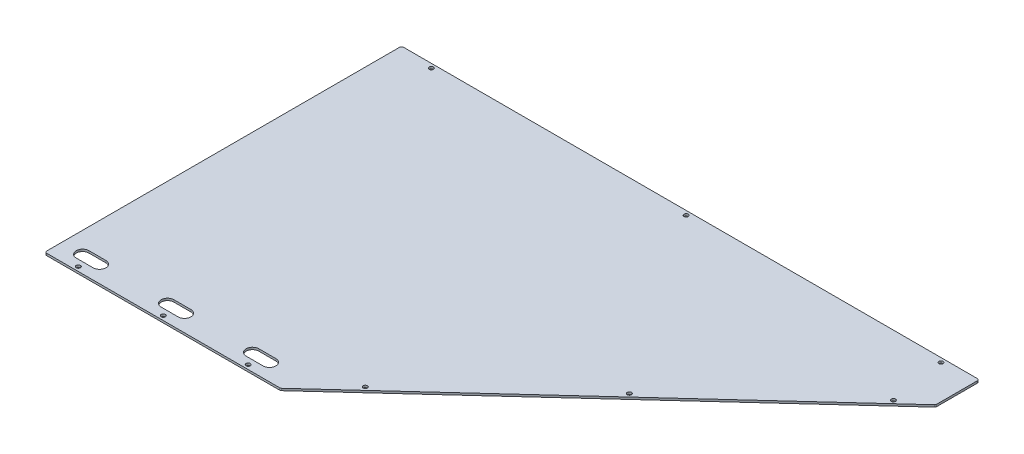
ISO-10303-21;
HEADER;
FILE_DESCRIPTION(('STEP AP214'),'2;1');
FILE_NAME('part.step','',(''),(''),'','','');
FILE_SCHEMA(('AUTOMOTIVE_DESIGN { 1 0 10303 214 1 1 1 1 }'));
ENDSEC;
DATA;
#1=APPLICATION_CONTEXT('core data for automotive mechanical design processes');
#2=APPLICATION_PROTOCOL_DEFINITION('international standard','automotive_design',2000,#1);
#3=PRODUCT_CONTEXT('',#1,'mechanical');
#4=PRODUCT('Part','Part','',(#3));
#5=PRODUCT_RELATED_PRODUCT_CATEGORY('part','',(#4));
#6=PRODUCT_DEFINITION_FORMATION('','',#4);
#7=PRODUCT_DEFINITION_CONTEXT('part definition',#1,'design');
#8=PRODUCT_DEFINITION('design','',#6,#7);
#9=PRODUCT_DEFINITION_SHAPE('','',#8);
#10=(LENGTH_UNIT() NAMED_UNIT(*) SI_UNIT(.MILLI.,.METRE.));
#11=(NAMED_UNIT(*) PLANE_ANGLE_UNIT() SI_UNIT($,.RADIAN.));
#12=(NAMED_UNIT(*) SI_UNIT($,.STERADIAN.) SOLID_ANGLE_UNIT());
#13=UNCERTAINTY_MEASURE_WITH_UNIT(LENGTH_MEASURE(1.E-05),#10,'distance_accuracy_value','');
#14=(GEOMETRIC_REPRESENTATION_CONTEXT(3) GLOBAL_UNCERTAINTY_ASSIGNED_CONTEXT((#13)) GLOBAL_UNIT_ASSIGNED_CONTEXT((#10,
#11,#12)) REPRESENTATION_CONTEXT('',''));
#15=CARTESIAN_POINT('',(0.,0.,0.));
#16=DIRECTION('',(0.,0.,1.));
#17=DIRECTION('',(1.,0.,0.));
#18=AXIS2_PLACEMENT_3D('',#15,#16,#17);
#19=CARTESIAN_POINT('',(0.,3.175,-533.4));
#20=DIRECTION('',(1.,0.,0.));
#21=DIRECTION('',(0.,0.,-1.));
#22=AXIS2_PLACEMENT_3D('',#19,#20,#21);
#23=PLANE('',#22);
#24=DIRECTION('',(0.,0.,1.));
#25=VECTOR('',#24,1.);
#26=CARTESIAN_POINT('',(0.,3.175,-533.4));
#27=LINE('',#26,#25);
#28=CARTESIAN_POINT('',(0.,3.175,-530.225));
#29=VERTEX_POINT('',#28);
#30=CARTESIAN_POINT('',(0.,3.175,-3.17500000000004));
#31=VERTEX_POINT('',#30);
#32=EDGE_CURVE('E340',#29,#31,#27,.T.);
#33=ORIENTED_EDGE('',*,*,#32,.F.);
#34=DIRECTION('',(0.,-1.,0.));
#35=VECTOR('',#34,1.);
#36=CARTESIAN_POINT('',(0.,3.175,-530.225));
#37=LINE('',#36,#35);
#38=CARTESIAN_POINT('',(0.,0.,-530.225));
#39=VERTEX_POINT('',#38);
#40=EDGE_CURVE('E371',#29,#39,#37,.T.);
#41=ORIENTED_EDGE('',*,*,#40,.T.);
#42=DIRECTION('',(0.,0.,1.));
#43=VECTOR('',#42,1.);
#44=CARTESIAN_POINT('',(0.,0.,-533.4));
#45=LINE('',#44,#43);
#46=CARTESIAN_POINT('',(0.,0.,-3.17500000000004));
#47=VERTEX_POINT('',#46);
#48=EDGE_CURVE('E339',#39,#47,#45,.T.);
#49=ORIENTED_EDGE('',*,*,#48,.T.);
#50=DIRECTION('',(0.,-1.,0.));
#51=VECTOR('',#50,1.);
#52=CARTESIAN_POINT('',(0.,3.175,-3.17500000000004));
#53=LINE('',#52,#51);
#54=EDGE_CURVE('E356',#47,#31,#53,.F.);
#55=ORIENTED_EDGE('',*,*,#54,.T.);
#56=EDGE_LOOP('',(#33,#41,#49,#55));
#57=FACE_BOUND('',#56,.T.);
#58=ADVANCED_FACE('F34',(#57),#23,.F.);
#59=CARTESIAN_POINT('',(0.,3.175,0.));
#60=DIRECTION('',(0.,0.,-1.));
#61=DIRECTION('',(-1.,0.,0.));
#62=AXIS2_PLACEMENT_3D('',#59,#60,#61);
#63=PLANE('',#62);
#64=DIRECTION('',(1.,0.,0.));
#65=VECTOR('',#64,1.);
#66=CARTESIAN_POINT('',(0.,0.,0.));
#67=LINE('',#66,#65);
#68=CARTESIAN_POINT('',(3.175,0.,0.));
#69=VERTEX_POINT('',#68);
#70=CARTESIAN_POINT('',(351.190310026367,0.,0.));
#71=VERTEX_POINT('',#70);
#72=EDGE_CURVE('E359',#69,#71,#67,.T.);
#73=ORIENTED_EDGE('',*,*,#72,.T.);
#74=DIRECTION('',(0.,-1.,0.));
#75=VECTOR('',#74,1.);
#76=CARTESIAN_POINT('',(351.190310026367,3.175,0.));
#77=LINE('',#76,#75);
#78=CARTESIAN_POINT('',(351.190310026367,3.175,0.));
#79=VERTEX_POINT('',#78);
#80=EDGE_CURVE('E407',#71,#79,#77,.F.);
#81=ORIENTED_EDGE('',*,*,#80,.T.);
#82=DIRECTION('',(1.,0.,0.));
#83=VECTOR('',#82,1.);
#84=CARTESIAN_POINT('',(0.,3.175,0.));
#85=LINE('',#84,#83);
#86=CARTESIAN_POINT('',(3.175,3.175,0.));
#87=VERTEX_POINT('',#86);
#88=EDGE_CURVE('E343',#87,#79,#85,.T.);
#89=ORIENTED_EDGE('',*,*,#88,.F.);
#90=DIRECTION('',(0.,-1.,0.));
#91=VECTOR('',#90,1.);
#92=CARTESIAN_POINT('',(3.175,3.175,0.));
#93=LINE('',#92,#91);
#94=EDGE_CURVE('E404',#87,#69,#93,.T.);
#95=ORIENTED_EDGE('',*,*,#94,.T.);
#96=EDGE_LOOP('',(#73,#81,#89,#95));
#97=FACE_BOUND('',#96,.T.);
#98=ADVANCED_FACE('F445',(#97),#63,.F.);
#99=CARTESIAN_POINT('',(352.425,3.175,0.));
#100=DIRECTION('',(-0.675590207615662,0.,-0.737277336810123));
#101=DIRECTION('',(-0.737277336810123,0.,0.675590207615662));
#102=AXIS2_PLACEMENT_3D('',#99,#100,#101);
#103=PLANE('',#102);
#104=DIRECTION('',(0.737277336810123,0.,-0.675590207615662));
#105=VECTOR('',#104,1.);
#106=CARTESIAN_POINT('',(352.425,3.175,0.));
#107=LINE('',#106,#105);
#108=CARTESIAN_POINT('',(353.335308935546,3.175,-0.834144455627875));
#109=VERTEX_POINT('',#108);
#110=CARTESIAN_POINT('',(862.56999890918,3.175,-467.461765769568));
#111=VERTEX_POINT('',#110);
#112=EDGE_CURVE('E347',#109,#111,#107,.T.);
#113=ORIENTED_EDGE('',*,*,#112,.F.);
#114=DIRECTION('',(0.,-1.,0.));
#115=VECTOR('',#114,1.);
#116=CARTESIAN_POINT('',(353.335308935546,3.175,-0.834144455627872));
#117=LINE('',#116,#115);
#118=CARTESIAN_POINT('',(353.335308935546,0.,-0.834144455627875));
#119=VERTEX_POINT('',#118);
#120=EDGE_CURVE('E401',#109,#119,#117,.T.);
#121=ORIENTED_EDGE('',*,*,#120,.T.);
#122=DIRECTION('',(0.737277336810123,0.,-0.675590207615662));
#123=VECTOR('',#122,1.);
#124=CARTESIAN_POINT('',(352.425,0.,0.));
#125=LINE('',#124,#123);
#126=CARTESIAN_POINT('',(862.56999890918,0.,-467.461765769568));
#127=VERTEX_POINT('',#126);
#128=EDGE_CURVE('E362',#119,#127,#125,.T.);
#129=ORIENTED_EDGE('',*,*,#128,.T.);
#130=DIRECTION('',(0.,-1.,0.));
#131=VECTOR('',#130,1.);
#132=CARTESIAN_POINT('',(862.56999890918,3.175,-467.461765769568));
#133=LINE('',#132,#131);
#134=EDGE_CURVE('E399',#127,#111,#133,.F.);
#135=ORIENTED_EDGE('',*,*,#134,.T.);
#136=EDGE_LOOP('',(#113,#121,#129,#135));
#137=FACE_BOUND('',#136,.T.);
#138=ADVANCED_FACE('F453',(#137),#103,.F.);
#139=CARTESIAN_POINT('',(863.6,3.175,-533.4));
#140=DIRECTION('',(-1.,0.,0.));
#141=DIRECTION('',(0.,0.,1.));
#142=AXIS2_PLACEMENT_3D('',#139,#140,#141);
#143=PLANE('',#142);
#144=DIRECTION('',(0.,0.,-1.));
#145=VECTOR('',#144,1.);
#146=CARTESIAN_POINT('',(863.6,0.,-533.4));
#147=LINE('',#146,#145);
#148=CARTESIAN_POINT('',(863.6,0.,-469.80262131394));
#149=VERTEX_POINT('',#148);
#150=CARTESIAN_POINT('',(863.6,0.,-530.225));
#151=VERTEX_POINT('',#150);
#152=EDGE_CURVE('E365',#149,#151,#147,.T.);
#153=ORIENTED_EDGE('',*,*,#152,.T.);
#154=DIRECTION('',(0.,-1.,0.));
#155=VECTOR('',#154,1.);
#156=CARTESIAN_POINT('',(863.6,3.175,-530.225));
#157=LINE('',#156,#155);
#158=CARTESIAN_POINT('',(863.6,3.175,-530.225));
#159=VERTEX_POINT('',#158);
#160=EDGE_CURVE('E11',#151,#159,#157,.F.);
#161=ORIENTED_EDGE('',*,*,#160,.T.);
#162=DIRECTION('',(0.,0.,-1.));
#163=VECTOR('',#162,1.);
#164=CARTESIAN_POINT('',(863.6,3.175,-533.4));
#165=LINE('',#164,#163);
#166=CARTESIAN_POINT('',(863.6,3.175,-469.80262131394));
#167=VERTEX_POINT('',#166);
#168=EDGE_CURVE('E350',#167,#159,#165,.T.);
#169=ORIENTED_EDGE('',*,*,#168,.F.);
#170=DIRECTION('',(0.,-1.,0.));
#171=VECTOR('',#170,1.);
#172=CARTESIAN_POINT('',(863.6,3.175,-469.80262131394));
#173=LINE('',#172,#171);
#174=EDGE_CURVE('E42',#167,#149,#173,.T.);
#175=ORIENTED_EDGE('',*,*,#174,.T.);
#176=EDGE_LOOP('',(#153,#161,#169,#175));
#177=FACE_BOUND('',#176,.T.);
#178=ADVANCED_FACE('F413',(#177),#143,.F.);
#179=CARTESIAN_POINT('',(863.6,3.175,-533.4));
#180=DIRECTION('',(0.,0.,1.));
#181=DIRECTION('',(1.,0.,0.));
#182=AXIS2_PLACEMENT_3D('',#179,#180,#181);
#183=PLANE('',#182);
#184=DIRECTION('',(-1.,0.,0.));
#185=VECTOR('',#184,1.);
#186=CARTESIAN_POINT('',(863.6,0.,-533.4));
#187=LINE('',#186,#185);
#188=CARTESIAN_POINT('',(860.425,0.,-533.4));
#189=VERTEX_POINT('',#188);
#190=CARTESIAN_POINT('',(3.17500000000004,0.,-533.4));
#191=VERTEX_POINT('',#190);
#192=EDGE_CURVE('E344',#189,#191,#187,.T.);
#193=ORIENTED_EDGE('',*,*,#192,.T.);
#194=DIRECTION('',(0.,-1.,0.));
#195=VECTOR('',#194,1.);
#196=CARTESIAN_POINT('',(3.17500000000004,3.175,-533.4));
#197=LINE('',#196,#195);
#198=CARTESIAN_POINT('',(3.17500000000004,3.175,-533.4));
#199=VERTEX_POINT('',#198);
#200=EDGE_CURVE('E387',#191,#199,#197,.F.);
#201=ORIENTED_EDGE('',*,*,#200,.T.);
#202=DIRECTION('',(-1.,0.,0.));
#203=VECTOR('',#202,1.);
#204=CARTESIAN_POINT('',(863.6,3.175,-533.4));
#205=LINE('',#204,#203);
#206=CARTESIAN_POINT('',(860.425,3.175,-533.4));
#207=VERTEX_POINT('',#206);
#208=EDGE_CURVE('E353',#207,#199,#205,.T.);
#209=ORIENTED_EDGE('',*,*,#208,.F.);
#210=DIRECTION('',(0.,-1.,0.));
#211=VECTOR('',#210,1.);
#212=CARTESIAN_POINT('',(860.425,3.175,-533.4));
#213=LINE('',#212,#211);
#214=EDGE_CURVE('E384',#207,#189,#213,.T.);
#215=ORIENTED_EDGE('',*,*,#214,.T.);
#216=EDGE_LOOP('',(#193,#201,#209,#215));
#217=FACE_BOUND('',#216,.T.);
#218=ADVANCED_FACE('F427',(#217),#183,.F.);
#219=CARTESIAN_POINT('',(0.,3.175,0.));
#220=DIRECTION('',(0.,1.,0.));
#221=DIRECTION('',(0.,0.,1.));
#222=AXIS2_PLACEMENT_3D('',#219,#220,#221);
#223=PLANE('',#222);
#224=CARTESIAN_POINT('',(285.132655013183,3.175,-25.4));
#225=DIRECTION('',(0.,1.,0.));
#226=DIRECTION('',(0.,0.,1.));
#227=AXIS2_PLACEMENT_3D('',#224,#225,#226);
#228=CIRCLE('',#227,9.525);
#229=CARTESIAN_POINT('',(285.132655013183,3.175,-34.925));
#230=VERTEX_POINT('',#229);
#231=CARTESIAN_POINT('',(285.132655013183,3.175,-15.875));
#232=VERTEX_POINT('',#231);
#233=EDGE_CURVE('E49',#230,#232,#228,.T.);
#234=ORIENTED_EDGE('',*,*,#233,.F.);
#235=DIRECTION('',(-1.,0.,0.));
#236=VECTOR('',#235,1.);
#237=CARTESIAN_POINT('',(285.132655013183,3.175,-34.925));
#238=LINE('',#237,#236);
#239=CARTESIAN_POINT('',(310.532655013183,3.175,-34.925));
#240=VERTEX_POINT('',#239);
#241=EDGE_CURVE('E261',#240,#230,#238,.T.);
#242=ORIENTED_EDGE('',*,*,#241,.F.);
#243=CARTESIAN_POINT('',(310.532655013183,3.175,-25.4));
#244=DIRECTION('',(0.,1.,0.));
#245=DIRECTION('',(0.,0.,1.));
#246=AXIS2_PLACEMENT_3D('',#243,#244,#245);
#247=CIRCLE('',#246,9.525);
#248=CARTESIAN_POINT('',(310.532655013183,3.175,-15.875));
#249=VERTEX_POINT('',#248);
#250=EDGE_CURVE('E275',#249,#240,#247,.T.);
#251=ORIENTED_EDGE('',*,*,#250,.F.);
#252=DIRECTION('',(1.,0.,0.));
#253=VECTOR('',#252,1.);
#254=CARTESIAN_POINT('',(285.132655013183,3.175,-15.875));
#255=LINE('',#254,#253);
#256=EDGE_CURVE('E272',#232,#249,#255,.T.);
#257=ORIENTED_EDGE('',*,*,#256,.F.);
#258=EDGE_LOOP('',(#234,#242,#251,#257));
#259=FACE_BOUND('',#258,.T.);
#260=CARTESIAN_POINT('',(158.132655013183,3.175,-25.4));
#261=DIRECTION('',(0.,1.,0.));
#262=DIRECTION('',(0.,0.,1.));
#263=AXIS2_PLACEMENT_3D('',#260,#261,#262);
#264=CIRCLE('',#263,9.525);
#265=CARTESIAN_POINT('',(158.132655013183,3.175,-34.925));
#266=VERTEX_POINT('',#265);
#267=CARTESIAN_POINT('',(158.132655013183,3.175,-15.875));
#268=VERTEX_POINT('',#267);
#269=EDGE_CURVE('E57',#266,#268,#264,.T.);
#270=ORIENTED_EDGE('',*,*,#269,.F.);
#271=DIRECTION('',(-1.,0.,0.));
#272=VECTOR('',#271,1.);
#273=CARTESIAN_POINT('',(158.132655013183,3.175,-34.925));
#274=LINE('',#273,#272);
#275=CARTESIAN_POINT('',(183.532655013183,3.175,-34.925));
#276=VERTEX_POINT('',#275);
#277=EDGE_CURVE('E231',#276,#266,#274,.T.);
#278=ORIENTED_EDGE('',*,*,#277,.F.);
#279=CARTESIAN_POINT('',(183.532655013183,3.175,-25.4));
#280=DIRECTION('',(0.,1.,0.));
#281=DIRECTION('',(0.,0.,1.));
#282=AXIS2_PLACEMENT_3D('',#279,#280,#281);
#283=CIRCLE('',#282,9.525);
#284=CARTESIAN_POINT('',(183.532655013183,3.175,-15.875));
#285=VERTEX_POINT('',#284);
#286=EDGE_CURVE('E246',#285,#276,#283,.T.);
#287=ORIENTED_EDGE('',*,*,#286,.F.);
#288=DIRECTION('',(1.,0.,0.));
#289=VECTOR('',#288,1.);
#290=CARTESIAN_POINT('',(158.132655013183,3.175,-15.875));
#291=LINE('',#290,#289);
#292=EDGE_CURVE('E242',#268,#285,#291,.T.);
#293=ORIENTED_EDGE('',*,*,#292,.F.);
#294=EDGE_LOOP('',(#270,#278,#287,#293));
#295=FACE_BOUND('',#294,.T.);
#296=CARTESIAN_POINT('',(31.1326550131833,3.175,-25.4));
#297=DIRECTION('',(0.,1.,0.));
#298=DIRECTION('',(0.,0.,1.));
#299=AXIS2_PLACEMENT_3D('',#296,#297,#298);
#300=CIRCLE('',#299,9.525);
#301=CARTESIAN_POINT('',(31.1326550131833,3.175,-34.925));
#302=VERTEX_POINT('',#301);
#303=CARTESIAN_POINT('',(31.1326550131833,3.175,-15.875));
#304=VERTEX_POINT('',#303);
#305=EDGE_CURVE('E189',#302,#304,#300,.T.);
#306=ORIENTED_EDGE('',*,*,#305,.F.);
#307=DIRECTION('',(-1.,0.,0.));
#308=VECTOR('',#307,1.);
#309=CARTESIAN_POINT('',(31.1326550131833,3.175,-34.925));
#310=LINE('',#309,#308);
#311=CARTESIAN_POINT('',(56.5326550131833,3.175,-34.925));
#312=VERTEX_POINT('',#311);
#313=EDGE_CURVE('E207',#312,#302,#310,.T.);
#314=ORIENTED_EDGE('',*,*,#313,.F.);
#315=CARTESIAN_POINT('',(56.5326550131833,3.175,-25.4));
#316=DIRECTION('',(0.,1.,0.));
#317=DIRECTION('',(0.,0.,1.));
#318=AXIS2_PLACEMENT_3D('',#315,#316,#317);
#319=CIRCLE('',#318,9.525);
#320=CARTESIAN_POINT('',(56.5326550131833,3.175,-15.875));
#321=VERTEX_POINT('',#320);
#322=EDGE_CURVE('E210',#321,#312,#319,.T.);
#323=ORIENTED_EDGE('',*,*,#322,.F.);
#324=DIRECTION('',(1.,0.,0.));
#325=VECTOR('',#324,1.);
#326=CARTESIAN_POINT('',(31.1326550131833,3.175,-15.875));
#327=LINE('',#326,#325);
#328=EDGE_CURVE('E216',#304,#321,#327,.T.);
#329=ORIENTED_EDGE('',*,*,#328,.F.);
#330=EDGE_LOOP('',(#306,#314,#323,#329));
#331=FACE_BOUND('',#330,.T.);
#332=CARTESIAN_POINT('',(43.8326550131833,3.175,-6.35));
#333=DIRECTION('',(0.,1.,0.));
#334=DIRECTION('',(0.,0.,1.));
#335=AXIS2_PLACEMENT_3D('',#332,#333,#334);
#336=CIRCLE('',#335,3.17499999999998);
#337=CARTESIAN_POINT('',(43.8326550131833,3.175,-3.17500000000002));
#338=VERTEX_POINT('',#337);
#339=EDGE_CURVE('E223',#338,#338,#336,.T.);
#340=ORIENTED_EDGE('',*,*,#339,.F.);
#341=EDGE_LOOP('',(#340));
#342=FACE_BOUND('',#341,.T.);
#343=CARTESIAN_POINT('',(170.832655013183,3.175,-6.35));
#344=DIRECTION('',(0.,1.,0.));
#345=DIRECTION('',(0.,0.,1.));
#346=AXIS2_PLACEMENT_3D('',#343,#344,#345);
#347=CIRCLE('',#346,3.17499999999998);
#348=CARTESIAN_POINT('',(170.832655013183,3.175,-3.17500000000002));
#349=VERTEX_POINT('',#348);
#350=EDGE_CURVE('E291',#349,#349,#347,.T.);
#351=ORIENTED_EDGE('',*,*,#350,.F.);
#352=EDGE_LOOP('',(#351));
#353=FACE_BOUND('',#352,.T.);
#354=CARTESIAN_POINT('',(297.832655013183,3.175,-6.35));
#355=DIRECTION('',(0.,1.,0.));
#356=DIRECTION('',(0.,0.,1.));
#357=AXIS2_PLACEMENT_3D('',#354,#355,#356);
#358=CIRCLE('',#357,3.17499999999998);
#359=CARTESIAN_POINT('',(297.832655013183,3.175,-3.17500000000002));
#360=VERTEX_POINT('',#359);
#361=EDGE_CURVE('E297',#360,#360,#358,.T.);
#362=ORIENTED_EDGE('',*,*,#361,.F.);
#363=EDGE_LOOP('',(#362));
#364=FACE_BOUND('',#363,.T.);
#365=CARTESIAN_POINT('',(414.05335700986,3.175,-65.0847545577841));
#366=DIRECTION('',(0.,1.,0.));
#367=DIRECTION('',(0.,0.,1.));
#368=AXIS2_PLACEMENT_3D('',#365,#366,#367);
#369=CIRCLE('',#368,3.17499999999998);
#370=CARTESIAN_POINT('',(414.05335700986,3.175,-61.9097545577841));
#371=VERTEX_POINT('',#370);
#372=EDGE_CURVE('E303',#371,#371,#369,.T.);
#373=ORIENTED_EDGE('',*,*,#372,.F.);
#374=EDGE_LOOP('',(#373));
#375=FACE_BOUND('',#374,.T.);
#376=CARTESIAN_POINT('',(620.048644914608,3.175,-253.8446585656));
#377=DIRECTION('',(0.,1.,0.));
#378=DIRECTION('',(0.,0.,1.));
#379=AXIS2_PLACEMENT_3D('',#376,#377,#378);
#380=CIRCLE('',#379,3.17500000000004);
#381=CARTESIAN_POINT('',(620.048644914608,3.175,-250.6696585656));
#382=VERTEX_POINT('',#381);
#383=EDGE_CURVE('E309',#382,#382,#380,.T.);
#384=ORIENTED_EDGE('',*,*,#383,.F.);
#385=EDGE_LOOP('',(#384));
#386=FACE_BOUND('',#385,.T.);
#387=CARTESIAN_POINT('',(826.043932819357,3.175,-442.604562573416));
#388=DIRECTION('',(0.,1.,0.));
#389=DIRECTION('',(0.,0.,1.));
#390=AXIS2_PLACEMENT_3D('',#387,#388,#389);
#391=CIRCLE('',#390,3.17500000000004);
#392=CARTESIAN_POINT('',(826.043932819357,3.175,-439.429562573416));
#393=VERTEX_POINT('',#392);
#394=EDGE_CURVE('E315',#393,#393,#391,.T.);
#395=ORIENTED_EDGE('',*,*,#394,.F.);
#396=EDGE_LOOP('',(#395));
#397=FACE_BOUND('',#396,.T.);
#398=CARTESIAN_POINT('',(50.8,3.175,-527.05));
#399=DIRECTION('',(0.,1.,0.));
#400=DIRECTION('',(0.,0.,1.));
#401=AXIS2_PLACEMENT_3D('',#398,#399,#400);
#402=CIRCLE('',#401,3.17499999999998);
#403=CARTESIAN_POINT('',(50.8,3.175,-523.875));
#404=VERTEX_POINT('',#403);
#405=EDGE_CURVE('E321',#404,#404,#402,.T.);
#406=ORIENTED_EDGE('',*,*,#405,.F.);
#407=EDGE_LOOP('',(#406));
#408=FACE_BOUND('',#407,.T.);
#409=CARTESIAN_POINT('',(431.8,3.175,-527.05));
#410=DIRECTION('',(0.,1.,0.));
#411=DIRECTION('',(0.,0.,1.));
#412=AXIS2_PLACEMENT_3D('',#409,#410,#411);
#413=CIRCLE('',#412,3.17499999999998);
#414=CARTESIAN_POINT('',(431.8,3.175,-523.875));
#415=VERTEX_POINT('',#414);
#416=EDGE_CURVE('E327',#415,#415,#413,.T.);
#417=ORIENTED_EDGE('',*,*,#416,.F.);
#418=EDGE_LOOP('',(#417));
#419=FACE_BOUND('',#418,.T.);
#420=CARTESIAN_POINT('',(812.8,3.175,-527.05));
#421=DIRECTION('',(0.,1.,0.));
#422=DIRECTION('',(0.,0.,1.));
#423=AXIS2_PLACEMENT_3D('',#420,#421,#422);
#424=CIRCLE('',#423,3.17500000000004);
#425=CARTESIAN_POINT('',(812.8,3.175,-523.875));
#426=VERTEX_POINT('',#425);
#427=EDGE_CURVE('E333',#426,#426,#424,.T.);
#428=ORIENTED_EDGE('',*,*,#427,.F.);
#429=EDGE_LOOP('',(#428));
#430=FACE_BOUND('',#429,.T.);
#431=ORIENTED_EDGE('',*,*,#208,.T.);
#432=CARTESIAN_POINT('',(3.175,3.175,-530.225));
#433=DIRECTION('',(0.,1.,0.));
#434=DIRECTION('',(0.,0.,1.));
#435=AXIS2_PLACEMENT_3D('',#432,#433,#434);
#436=CIRCLE('',#435,3.175);
#437=EDGE_CURVE('E397',#199,#29,#436,.T.);
#438=ORIENTED_EDGE('',*,*,#437,.T.);
#439=ORIENTED_EDGE('',*,*,#32,.T.);
#440=CARTESIAN_POINT('',(3.175,3.175,-3.175));
#441=DIRECTION('',(0.,1.,0.));
#442=DIRECTION('',(0.,0.,1.));
#443=AXIS2_PLACEMENT_3D('',#440,#441,#442);
#444=CIRCLE('',#443,3.175);
#445=EDGE_CURVE('E393',#31,#87,#444,.T.);
#446=ORIENTED_EDGE('',*,*,#445,.T.);
#447=ORIENTED_EDGE('',*,*,#88,.T.);
#448=CARTESIAN_POINT('',(351.190310026367,3.175,-3.175));
#449=DIRECTION('',(0.,1.,0.));
#450=DIRECTION('',(0.,0.,1.));
#451=AXIS2_PLACEMENT_3D('',#448,#449,#450);
#452=CIRCLE('',#451,3.175);
#453=EDGE_CURVE('E395',#79,#109,#452,.T.);
#454=ORIENTED_EDGE('',*,*,#453,.T.);
#455=ORIENTED_EDGE('',*,*,#112,.T.);
#456=CARTESIAN_POINT('',(860.425,3.175,-469.80262131394));
#457=DIRECTION('',(0.,1.,0.));
#458=DIRECTION('',(0.,0.,1.));
#459=AXIS2_PLACEMENT_3D('',#456,#457,#458);
#460=CIRCLE('',#459,3.175);
#461=EDGE_CURVE('E389',#111,#167,#460,.T.);
#462=ORIENTED_EDGE('',*,*,#461,.T.);
#463=ORIENTED_EDGE('',*,*,#168,.T.);
#464=CARTESIAN_POINT('',(860.425,3.175,-530.225));
#465=DIRECTION('',(0.,1.,0.));
#466=DIRECTION('',(0.,0.,1.));
#467=AXIS2_PLACEMENT_3D('',#464,#465,#466);
#468=CIRCLE('',#467,3.175);
#469=EDGE_CURVE('E391',#159,#207,#468,.T.);
#470=ORIENTED_EDGE('',*,*,#469,.T.);
#471=EDGE_LOOP('',(#431,#438,#439,#446,#447,#454,#455,#462,#463,#470));
#472=FACE_BOUND('',#471,.T.);
#473=ADVANCED_FACE('F431',(#259,#295,#331,#342,#353,#364,#375,#386,#397,#408,#419,#430,#472),
#223,.T.);
#474=CARTESIAN_POINT('',(0.,0.,0.));
#475=DIRECTION('',(0.,1.,0.));
#476=DIRECTION('',(0.,0.,1.));
#477=AXIS2_PLACEMENT_3D('',#474,#475,#476);
#478=PLANE('',#477);
#479=DIRECTION('',(-1.,0.,0.));
#480=VECTOR('',#479,1.);
#481=CARTESIAN_POINT('',(285.132655013183,0.,-34.925));
#482=LINE('',#481,#480);
#483=CARTESIAN_POINT('',(310.532655013183,0.,-34.925));
#484=VERTEX_POINT('',#483);
#485=CARTESIAN_POINT('',(285.132655013183,0.,-34.925));
#486=VERTEX_POINT('',#485);
#487=EDGE_CURVE('E267',#484,#486,#482,.T.);
#488=ORIENTED_EDGE('',*,*,#487,.T.);
#489=CARTESIAN_POINT('',(285.132655013183,0.,-25.4));
#490=DIRECTION('',(0.,1.,0.));
#491=DIRECTION('',(0.,0.,1.));
#492=AXIS2_PLACEMENT_3D('',#489,#490,#491);
#493=CIRCLE('',#492,9.525);
#494=CARTESIAN_POINT('',(285.132655013183,0.,-15.875));
#495=VERTEX_POINT('',#494);
#496=EDGE_CURVE('E257',#486,#495,#493,.T.);
#497=ORIENTED_EDGE('',*,*,#496,.T.);
#498=DIRECTION('',(1.,0.,0.));
#499=VECTOR('',#498,1.);
#500=CARTESIAN_POINT('',(285.132655013183,0.,-15.875));
#501=LINE('',#500,#499);
#502=CARTESIAN_POINT('',(310.532655013183,0.,-15.875));
#503=VERTEX_POINT('',#502);
#504=EDGE_CURVE('E260',#495,#503,#501,.T.);
#505=ORIENTED_EDGE('',*,*,#504,.T.);
#506=CARTESIAN_POINT('',(310.532655013183,0.,-25.4));
#507=DIRECTION('',(0.,1.,0.));
#508=DIRECTION('',(0.,0.,1.));
#509=AXIS2_PLACEMENT_3D('',#506,#507,#508);
#510=CIRCLE('',#509,9.525);
#511=EDGE_CURVE('E264',#503,#484,#510,.T.);
#512=ORIENTED_EDGE('',*,*,#511,.T.);
#513=EDGE_LOOP('',(#488,#497,#505,#512));
#514=FACE_BOUND('',#513,.T.);
#515=DIRECTION('',(-1.,0.,0.));
#516=VECTOR('',#515,1.);
#517=CARTESIAN_POINT('',(158.132655013183,0.,-34.925));
#518=LINE('',#517,#516);
#519=CARTESIAN_POINT('',(183.532655013183,0.,-34.925));
#520=VERTEX_POINT('',#519);
#521=CARTESIAN_POINT('',(158.132655013183,0.,-34.925));
#522=VERTEX_POINT('',#521);
#523=EDGE_CURVE('E237',#520,#522,#518,.T.);
#524=ORIENTED_EDGE('',*,*,#523,.T.);
#525=CARTESIAN_POINT('',(158.132655013183,0.,-25.4));
#526=DIRECTION('',(0.,1.,0.));
#527=DIRECTION('',(0.,0.,1.));
#528=AXIS2_PLACEMENT_3D('',#525,#526,#527);
#529=CIRCLE('',#528,9.525);
#530=CARTESIAN_POINT('',(158.132655013183,0.,-15.875));
#531=VERTEX_POINT('',#530);
#532=EDGE_CURVE('E227',#522,#531,#529,.T.);
#533=ORIENTED_EDGE('',*,*,#532,.T.);
#534=DIRECTION('',(1.,0.,0.));
#535=VECTOR('',#534,1.);
#536=CARTESIAN_POINT('',(158.132655013183,0.,-15.875));
#537=LINE('',#536,#535);
#538=CARTESIAN_POINT('',(183.532655013183,0.,-15.875));
#539=VERTEX_POINT('',#538);
#540=EDGE_CURVE('E230',#531,#539,#537,.T.);
#541=ORIENTED_EDGE('',*,*,#540,.T.);
#542=CARTESIAN_POINT('',(183.532655013183,0.,-25.4));
#543=DIRECTION('',(0.,1.,0.));
#544=DIRECTION('',(0.,0.,1.));
#545=AXIS2_PLACEMENT_3D('',#542,#543,#544);
#546=CIRCLE('',#545,9.525);
#547=EDGE_CURVE('E234',#539,#520,#546,.T.);
#548=ORIENTED_EDGE('',*,*,#547,.T.);
#549=EDGE_LOOP('',(#524,#533,#541,#548));
#550=FACE_BOUND('',#549,.T.);
#551=DIRECTION('',(-1.,0.,0.));
#552=VECTOR('',#551,1.);
#553=CARTESIAN_POINT('',(31.1326550131833,0.,-34.925));
#554=LINE('',#553,#552);
#555=CARTESIAN_POINT('',(56.5326550131833,0.,-34.925));
#556=VERTEX_POINT('',#555);
#557=CARTESIAN_POINT('',(31.1326550131833,0.,-34.925));
#558=VERTEX_POINT('',#557);
#559=EDGE_CURVE('E194',#556,#558,#554,.T.);
#560=ORIENTED_EDGE('',*,*,#559,.T.);
#561=CARTESIAN_POINT('',(31.1326550131833,0.,-25.4));
#562=DIRECTION('',(0.,1.,0.));
#563=DIRECTION('',(0.,0.,1.));
#564=AXIS2_PLACEMENT_3D('',#561,#562,#563);
#565=CIRCLE('',#564,9.525);
#566=CARTESIAN_POINT('',(31.1326550131833,0.,-15.875));
#567=VERTEX_POINT('',#566);
#568=EDGE_CURVE('E186',#558,#567,#565,.T.);
#569=ORIENTED_EDGE('',*,*,#568,.T.);
#570=DIRECTION('',(1.,0.,0.));
#571=VECTOR('',#570,1.);
#572=CARTESIAN_POINT('',(31.1326550131833,0.,-15.875));
#573=LINE('',#572,#571);
#574=CARTESIAN_POINT('',(56.5326550131833,0.,-15.875));
#575=VERTEX_POINT('',#574);
#576=EDGE_CURVE('E198',#567,#575,#573,.T.);
#577=ORIENTED_EDGE('',*,*,#576,.T.);
#578=CARTESIAN_POINT('',(56.5326550131833,0.,-25.4));
#579=DIRECTION('',(0.,1.,0.));
#580=DIRECTION('',(0.,0.,1.));
#581=AXIS2_PLACEMENT_3D('',#578,#579,#580);
#582=CIRCLE('',#581,9.525);
#583=EDGE_CURVE('E202',#575,#556,#582,.T.);
#584=ORIENTED_EDGE('',*,*,#583,.T.);
#585=EDGE_LOOP('',(#560,#569,#577,#584));
#586=FACE_BOUND('',#585,.T.);
#587=CARTESIAN_POINT('',(43.8326550131833,0.,-6.35));
#588=DIRECTION('',(0.,1.,0.));
#589=DIRECTION('',(0.,0.,1.));
#590=AXIS2_PLACEMENT_3D('',#587,#588,#589);
#591=CIRCLE('',#590,3.175);
#592=CARTESIAN_POINT('',(43.8326550131833,0.,-3.175));
#593=VERTEX_POINT('',#592);
#594=EDGE_CURVE('E288',#593,#593,#591,.T.);
#595=ORIENTED_EDGE('',*,*,#594,.T.);
#596=EDGE_LOOP('',(#595));
#597=FACE_BOUND('',#596,.T.);
#598=CARTESIAN_POINT('',(170.832655013183,0.,-6.35));
#599=DIRECTION('',(0.,1.,0.));
#600=DIRECTION('',(0.,0.,1.));
#601=AXIS2_PLACEMENT_3D('',#598,#599,#600);
#602=CIRCLE('',#601,3.17500000000001);
#603=CARTESIAN_POINT('',(170.832655013183,0.,-3.17499999999999));
#604=VERTEX_POINT('',#603);
#605=EDGE_CURVE('E294',#604,#604,#602,.T.);
#606=ORIENTED_EDGE('',*,*,#605,.T.);
#607=EDGE_LOOP('',(#606));
#608=FACE_BOUND('',#607,.T.);
#609=CARTESIAN_POINT('',(297.832655013183,0.,-6.35));
#610=DIRECTION('',(0.,1.,0.));
#611=DIRECTION('',(0.,0.,1.));
#612=AXIS2_PLACEMENT_3D('',#609,#610,#611);
#613=CIRCLE('',#612,3.17499999999998);
#614=CARTESIAN_POINT('',(297.832655013183,0.,-3.17500000000002));
#615=VERTEX_POINT('',#614);
#616=EDGE_CURVE('E300',#615,#615,#613,.T.);
#617=ORIENTED_EDGE('',*,*,#616,.T.);
#618=EDGE_LOOP('',(#617));
#619=FACE_BOUND('',#618,.T.);
#620=CARTESIAN_POINT('',(414.05335700986,0.,-65.0847545577841));
#621=DIRECTION('',(0.,1.,0.));
#622=DIRECTION('',(0.,0.,1.));
#623=AXIS2_PLACEMENT_3D('',#620,#621,#622);
#624=CIRCLE('',#623,3.17499999999998);
#625=CARTESIAN_POINT('',(414.05335700986,0.,-61.9097545577841));
#626=VERTEX_POINT('',#625);
#627=EDGE_CURVE('E306',#626,#626,#624,.T.);
#628=ORIENTED_EDGE('',*,*,#627,.T.);
#629=EDGE_LOOP('',(#628));
#630=FACE_BOUND('',#629,.T.);
#631=CARTESIAN_POINT('',(620.048644914608,0.,-253.8446585656));
#632=DIRECTION('',(0.,1.,0.));
#633=DIRECTION('',(0.,0.,1.));
#634=AXIS2_PLACEMENT_3D('',#631,#632,#633);
#635=CIRCLE('',#634,3.17500000000004);
#636=CARTESIAN_POINT('',(620.048644914608,0.,-250.6696585656));
#637=VERTEX_POINT('',#636);
#638=EDGE_CURVE('E312',#637,#637,#635,.T.);
#639=ORIENTED_EDGE('',*,*,#638,.T.);
#640=EDGE_LOOP('',(#639));
#641=FACE_BOUND('',#640,.T.);
#642=CARTESIAN_POINT('',(826.043932819357,0.,-442.604562573416));
#643=DIRECTION('',(0.,1.,0.));
#644=DIRECTION('',(0.,0.,1.));
#645=AXIS2_PLACEMENT_3D('',#642,#643,#644);
#646=CIRCLE('',#645,3.17500000000004);
#647=CARTESIAN_POINT('',(826.043932819357,0.,-439.429562573416));
#648=VERTEX_POINT('',#647);
#649=EDGE_CURVE('E318',#648,#648,#646,.T.);
#650=ORIENTED_EDGE('',*,*,#649,.T.);
#651=EDGE_LOOP('',(#650));
#652=FACE_BOUND('',#651,.T.);
#653=CARTESIAN_POINT('',(50.8,0.,-527.05));
#654=DIRECTION('',(0.,1.,0.));
#655=DIRECTION('',(0.,0.,1.));
#656=AXIS2_PLACEMENT_3D('',#653,#654,#655);
#657=CIRCLE('',#656,3.175);
#658=CARTESIAN_POINT('',(50.8,0.,-523.875));
#659=VERTEX_POINT('',#658);
#660=EDGE_CURVE('E324',#659,#659,#657,.T.);
#661=ORIENTED_EDGE('',*,*,#660,.T.);
#662=EDGE_LOOP('',(#661));
#663=FACE_BOUND('',#662,.T.);
#664=CARTESIAN_POINT('',(431.8,0.,-527.05));
#665=DIRECTION('',(0.,1.,0.));
#666=DIRECTION('',(0.,0.,1.));
#667=AXIS2_PLACEMENT_3D('',#664,#665,#666);
#668=CIRCLE('',#667,3.17499999999998);
#669=CARTESIAN_POINT('',(431.8,0.,-523.875));
#670=VERTEX_POINT('',#669);
#671=EDGE_CURVE('E330',#670,#670,#668,.T.);
#672=ORIENTED_EDGE('',*,*,#671,.T.);
#673=EDGE_LOOP('',(#672));
#674=FACE_BOUND('',#673,.T.);
#675=CARTESIAN_POINT('',(812.8,0.,-527.05));
#676=DIRECTION('',(0.,1.,0.));
#677=DIRECTION('',(0.,0.,1.));
#678=AXIS2_PLACEMENT_3D('',#675,#676,#677);
#679=CIRCLE('',#678,3.17500000000004);
#680=CARTESIAN_POINT('',(812.8,0.,-523.875));
#681=VERTEX_POINT('',#680);
#682=EDGE_CURVE('E336',#681,#681,#679,.T.);
#683=ORIENTED_EDGE('',*,*,#682,.T.);
#684=EDGE_LOOP('',(#683));
#685=FACE_BOUND('',#684,.T.);
#686=ORIENTED_EDGE('',*,*,#48,.F.);
#687=CARTESIAN_POINT('',(3.175,0.,-530.225));
#688=DIRECTION('',(0.,1.,0.));
#689=DIRECTION('',(0.,0.,1.));
#690=AXIS2_PLACEMENT_3D('',#687,#688,#689);
#691=CIRCLE('',#690,3.175);
#692=EDGE_CURVE('E382',#39,#191,#691,.F.);
#693=ORIENTED_EDGE('',*,*,#692,.T.);
#694=ORIENTED_EDGE('',*,*,#192,.F.);
#695=CARTESIAN_POINT('',(860.425,0.,-530.225));
#696=DIRECTION('',(0.,1.,0.));
#697=DIRECTION('',(0.,0.,1.));
#698=AXIS2_PLACEMENT_3D('',#695,#696,#697);
#699=CIRCLE('',#698,3.175);
#700=EDGE_CURVE('E376',#189,#151,#699,.F.);
#701=ORIENTED_EDGE('',*,*,#700,.T.);
#702=ORIENTED_EDGE('',*,*,#152,.F.);
#703=CARTESIAN_POINT('',(860.425,0.,-469.80262131394));
#704=DIRECTION('',(0.,1.,0.));
#705=DIRECTION('',(0.,0.,1.));
#706=AXIS2_PLACEMENT_3D('',#703,#704,#705);
#707=CIRCLE('',#706,3.175);
#708=EDGE_CURVE('E374',#149,#127,#707,.F.);
#709=ORIENTED_EDGE('',*,*,#708,.T.);
#710=ORIENTED_EDGE('',*,*,#128,.F.);
#711=CARTESIAN_POINT('',(351.190310026367,0.,-3.175));
#712=DIRECTION('',(0.,1.,0.));
#713=DIRECTION('',(0.,0.,1.));
#714=AXIS2_PLACEMENT_3D('',#711,#712,#713);
#715=CIRCLE('',#714,3.175);
#716=EDGE_CURVE('E380',#119,#71,#715,.F.);
#717=ORIENTED_EDGE('',*,*,#716,.T.);
#718=ORIENTED_EDGE('',*,*,#72,.F.);
#719=CARTESIAN_POINT('',(3.175,0.,-3.175));
#720=DIRECTION('',(0.,1.,0.));
#721=DIRECTION('',(0.,0.,1.));
#722=AXIS2_PLACEMENT_3D('',#719,#720,#721);
#723=CIRCLE('',#722,3.175);
#724=EDGE_CURVE('E378',#69,#47,#723,.F.);
#725=ORIENTED_EDGE('',*,*,#724,.T.);
#726=EDGE_LOOP('',(#686,#693,#694,#701,#702,#709,#710,#717,#718,#725));
#727=FACE_BOUND('',#726,.T.);
#728=ADVANCED_FACE('F204',(#514,#550,#586,#597,#608,#619,#630,#641,#652,#663,#674,#685,#727),
#478,.F.);
#729=CARTESIAN_POINT('',(3.175,3.175,-530.225));
#730=DIRECTION('',(0.,-1.,0.));
#731=DIRECTION('',(0.,0.,-1.));
#732=AXIS2_PLACEMENT_3D('',#729,#730,#731);
#733=CYLINDRICAL_SURFACE('',#732,3.175);
#734=ORIENTED_EDGE('',*,*,#437,.F.);
#735=ORIENTED_EDGE('',*,*,#200,.F.);
#736=ORIENTED_EDGE('',*,*,#692,.F.);
#737=ORIENTED_EDGE('',*,*,#40,.F.);
#738=EDGE_LOOP('',(#734,#735,#736,#737));
#739=FACE_BOUND('',#738,.T.);
#740=ADVANCED_FACE('F435',(#739),#733,.T.);
#741=CARTESIAN_POINT('',(351.190310026367,3.175,-3.175));
#742=DIRECTION('',(0.,-1.,0.));
#743=DIRECTION('',(0.,0.,-1.));
#744=AXIS2_PLACEMENT_3D('',#741,#742,#743);
#745=CYLINDRICAL_SURFACE('',#744,3.175);
#746=ORIENTED_EDGE('',*,*,#453,.F.);
#747=ORIENTED_EDGE('',*,*,#80,.F.);
#748=ORIENTED_EDGE('',*,*,#716,.F.);
#749=ORIENTED_EDGE('',*,*,#120,.F.);
#750=EDGE_LOOP('',(#746,#747,#748,#749));
#751=FACE_BOUND('',#750,.T.);
#752=ADVANCED_FACE('F451',(#751),#745,.T.);
#753=CARTESIAN_POINT('',(3.175,3.175,-3.175));
#754=DIRECTION('',(0.,-1.,0.));
#755=DIRECTION('',(0.,0.,-1.));
#756=AXIS2_PLACEMENT_3D('',#753,#754,#755);
#757=CYLINDRICAL_SURFACE('',#756,3.175);
#758=ORIENTED_EDGE('',*,*,#445,.F.);
#759=ORIENTED_EDGE('',*,*,#54,.F.);
#760=ORIENTED_EDGE('',*,*,#724,.F.);
#761=ORIENTED_EDGE('',*,*,#94,.F.);
#762=EDGE_LOOP('',(#758,#759,#760,#761));
#763=FACE_BOUND('',#762,.T.);
#764=ADVANCED_FACE('F442',(#763),#757,.T.);
#765=CARTESIAN_POINT('',(860.425,3.175,-530.225));
#766=DIRECTION('',(0.,-1.,0.));
#767=DIRECTION('',(0.,0.,-1.));
#768=AXIS2_PLACEMENT_3D('',#765,#766,#767);
#769=CYLINDRICAL_SURFACE('',#768,3.175);
#770=ORIENTED_EDGE('',*,*,#469,.F.);
#771=ORIENTED_EDGE('',*,*,#160,.F.);
#772=ORIENTED_EDGE('',*,*,#700,.F.);
#773=ORIENTED_EDGE('',*,*,#214,.F.);
#774=EDGE_LOOP('',(#770,#771,#772,#773));
#775=FACE_BOUND('',#774,.T.);
#776=ADVANCED_FACE('F424',(#775),#769,.T.);
#777=CARTESIAN_POINT('',(860.425,3.175,-469.80262131394));
#778=DIRECTION('',(0.,-1.,0.));
#779=DIRECTION('',(0.,0.,-1.));
#780=AXIS2_PLACEMENT_3D('',#777,#778,#779);
#781=CYLINDRICAL_SURFACE('',#780,3.175);
#782=ORIENTED_EDGE('',*,*,#461,.F.);
#783=ORIENTED_EDGE('',*,*,#134,.F.);
#784=ORIENTED_EDGE('',*,*,#708,.F.);
#785=ORIENTED_EDGE('',*,*,#174,.F.);
#786=EDGE_LOOP('',(#782,#783,#784,#785));
#787=FACE_BOUND('',#786,.T.);
#788=ADVANCED_FACE('F36',(#787),#781,.T.);
#789=CARTESIAN_POINT('',(812.8,3.175,-527.05));
#790=DIRECTION('',(0.,1.,0.));
#791=DIRECTION('',(0.,0.,1.));
#792=AXIS2_PLACEMENT_3D('',#789,#790,#791);
#793=CYLINDRICAL_SURFACE('',#792,3.17500000000004);
#794=ORIENTED_EDGE('',*,*,#682,.F.);
#795=EDGE_LOOP('',(#794));
#796=FACE_BOUND('',#795,.T.);
#797=ORIENTED_EDGE('',*,*,#427,.T.);
#798=EDGE_LOOP('',(#797));
#799=FACE_BOUND('',#798,.T.);
#800=ADVANCED_FACE('F456',(#796,#799),#793,.F.);
#801=CARTESIAN_POINT('',(431.8,3.175,-527.05));
#802=DIRECTION('',(0.,1.,0.));
#803=DIRECTION('',(0.,0.,1.));
#804=AXIS2_PLACEMENT_3D('',#801,#802,#803);
#805=CYLINDRICAL_SURFACE('',#804,3.17499999999998);
#806=ORIENTED_EDGE('',*,*,#671,.F.);
#807=EDGE_LOOP('',(#806));
#808=FACE_BOUND('',#807,.T.);
#809=ORIENTED_EDGE('',*,*,#416,.T.);
#810=EDGE_LOOP('',(#809));
#811=FACE_BOUND('',#810,.T.);
#812=ADVANCED_FACE('F461',(#808,#811),#805,.F.);
#813=CARTESIAN_POINT('',(50.8,3.175,-527.05));
#814=DIRECTION('',(0.,1.,0.));
#815=DIRECTION('',(0.,0.,1.));
#816=AXIS2_PLACEMENT_3D('',#813,#814,#815);
#817=CYLINDRICAL_SURFACE('',#816,3.17499999999999);
#818=ORIENTED_EDGE('',*,*,#660,.F.);
#819=EDGE_LOOP('',(#818));
#820=FACE_BOUND('',#819,.T.);
#821=ORIENTED_EDGE('',*,*,#405,.T.);
#822=EDGE_LOOP('',(#821));
#823=FACE_BOUND('',#822,.T.);
#824=ADVANCED_FACE('F504',(#820,#823),#817,.F.);
#825=CARTESIAN_POINT('',(826.043932819357,3.175,-442.604562573416));
#826=DIRECTION('',(0.,1.,0.));
#827=DIRECTION('',(0.,0.,1.));
#828=AXIS2_PLACEMENT_3D('',#825,#826,#827);
#829=CYLINDRICAL_SURFACE('',#828,3.17500000000004);
#830=ORIENTED_EDGE('',*,*,#649,.F.);
#831=EDGE_LOOP('',(#830));
#832=FACE_BOUND('',#831,.T.);
#833=ORIENTED_EDGE('',*,*,#394,.T.);
#834=EDGE_LOOP('',(#833));
#835=FACE_BOUND('',#834,.T.);
#836=ADVANCED_FACE('F514',(#832,#835),#829,.F.);
#837=CARTESIAN_POINT('',(620.048644914608,3.175,-253.8446585656));
#838=DIRECTION('',(0.,1.,0.));
#839=DIRECTION('',(0.,0.,1.));
#840=AXIS2_PLACEMENT_3D('',#837,#838,#839);
#841=CYLINDRICAL_SURFACE('',#840,3.17500000000004);
#842=ORIENTED_EDGE('',*,*,#638,.F.);
#843=EDGE_LOOP('',(#842));
#844=FACE_BOUND('',#843,.T.);
#845=ORIENTED_EDGE('',*,*,#383,.T.);
#846=EDGE_LOOP('',(#845));
#847=FACE_BOUND('',#846,.T.);
#848=ADVANCED_FACE('F524',(#844,#847),#841,.F.);
#849=CARTESIAN_POINT('',(414.05335700986,3.175,-65.0847545577841));
#850=DIRECTION('',(0.,1.,0.));
#851=DIRECTION('',(0.,0.,1.));
#852=AXIS2_PLACEMENT_3D('',#849,#850,#851);
#853=CYLINDRICAL_SURFACE('',#852,3.17499999999998);
#854=ORIENTED_EDGE('',*,*,#627,.F.);
#855=EDGE_LOOP('',(#854));
#856=FACE_BOUND('',#855,.T.);
#857=ORIENTED_EDGE('',*,*,#372,.T.);
#858=EDGE_LOOP('',(#857));
#859=FACE_BOUND('',#858,.T.);
#860=ADVANCED_FACE('F534',(#856,#859),#853,.F.);
#861=CARTESIAN_POINT('',(297.832655013183,3.175,-6.35));
#862=DIRECTION('',(0.,1.,0.));
#863=DIRECTION('',(0.,0.,1.));
#864=AXIS2_PLACEMENT_3D('',#861,#862,#863);
#865=CYLINDRICAL_SURFACE('',#864,3.17499999999998);
#866=ORIENTED_EDGE('',*,*,#616,.F.);
#867=EDGE_LOOP('',(#866));
#868=FACE_BOUND('',#867,.T.);
#869=ORIENTED_EDGE('',*,*,#361,.T.);
#870=EDGE_LOOP('',(#869));
#871=FACE_BOUND('',#870,.T.);
#872=ADVANCED_FACE('F544',(#868,#871),#865,.F.);
#873=CARTESIAN_POINT('',(170.832655013183,3.175,-6.35));
#874=DIRECTION('',(0.,1.,0.));
#875=DIRECTION('',(0.,0.,1.));
#876=AXIS2_PLACEMENT_3D('',#873,#874,#875);
#877=CYLINDRICAL_SURFACE('',#876,3.175);
#878=ORIENTED_EDGE('',*,*,#605,.F.);
#879=EDGE_LOOP('',(#878));
#880=FACE_BOUND('',#879,.T.);
#881=ORIENTED_EDGE('',*,*,#350,.T.);
#882=EDGE_LOOP('',(#881));
#883=FACE_BOUND('',#882,.T.);
#884=ADVANCED_FACE('F554',(#880,#883),#877,.F.);
#885=CARTESIAN_POINT('',(43.8326550131833,3.175,-6.35));
#886=DIRECTION('',(0.,1.,0.));
#887=DIRECTION('',(0.,0.,1.));
#888=AXIS2_PLACEMENT_3D('',#885,#886,#887);
#889=CYLINDRICAL_SURFACE('',#888,3.17499999999999);
#890=ORIENTED_EDGE('',*,*,#594,.F.);
#891=EDGE_LOOP('',(#890));
#892=FACE_BOUND('',#891,.T.);
#893=ORIENTED_EDGE('',*,*,#339,.T.);
#894=EDGE_LOOP('',(#893));
#895=FACE_BOUND('',#894,.T.);
#896=ADVANCED_FACE('F564',(#892,#895),#889,.F.);
#897=CARTESIAN_POINT('',(31.1326550131833,0.,-25.4));
#898=DIRECTION('',(0.,1.,0.));
#899=DIRECTION('',(0.,0.,1.));
#900=AXIS2_PLACEMENT_3D('',#897,#898,#899);
#901=CYLINDRICAL_SURFACE('',#900,9.525);
#902=ORIENTED_EDGE('',*,*,#305,.T.);
#903=DIRECTION('',(0.,1.,0.));
#904=VECTOR('',#903,1.);
#905=CARTESIAN_POINT('',(31.1326550131833,0.,-15.875));
#906=LINE('',#905,#904);
#907=EDGE_CURVE('E182',#567,#304,#906,.T.);
#908=ORIENTED_EDGE('',*,*,#907,.F.);
#909=ORIENTED_EDGE('',*,*,#568,.F.);
#910=DIRECTION('',(0.,1.,0.));
#911=VECTOR('',#910,1.);
#912=CARTESIAN_POINT('',(31.1326550131833,0.,-34.925));
#913=LINE('',#912,#911);
#914=EDGE_CURVE('E221',#558,#302,#913,.T.);
#915=ORIENTED_EDGE('',*,*,#914,.T.);
#916=EDGE_LOOP('',(#902,#908,#909,#915));
#917=FACE_BOUND('',#916,.T.);
#918=ADVANCED_FACE('F184',(#917),#901,.F.);
#919=CARTESIAN_POINT('',(31.1326550131833,0.,-34.925));
#920=DIRECTION('',(0.,0.,-1.));
#921=DIRECTION('',(-1.,0.,0.));
#922=AXIS2_PLACEMENT_3D('',#919,#920,#921);
#923=PLANE('',#922);
#924=ORIENTED_EDGE('',*,*,#313,.T.);
#925=ORIENTED_EDGE('',*,*,#914,.F.);
#926=ORIENTED_EDGE('',*,*,#559,.F.);
#927=DIRECTION('',(0.,1.,0.));
#928=VECTOR('',#927,1.);
#929=CARTESIAN_POINT('',(56.5326550131833,0.,-34.925));
#930=LINE('',#929,#928);
#931=EDGE_CURVE('E224',#556,#312,#930,.T.);
#932=ORIENTED_EDGE('',*,*,#931,.T.);
#933=EDGE_LOOP('',(#924,#925,#926,#932));
#934=FACE_BOUND('',#933,.T.);
#935=ADVANCED_FACE('F604',(#934),#923,.F.);
#936=CARTESIAN_POINT('',(56.5326550131833,0.,-25.4));
#937=DIRECTION('',(0.,1.,0.));
#938=DIRECTION('',(0.,0.,1.));
#939=AXIS2_PLACEMENT_3D('',#936,#937,#938);
#940=CYLINDRICAL_SURFACE('',#939,9.525);
#941=ORIENTED_EDGE('',*,*,#322,.T.);
#942=ORIENTED_EDGE('',*,*,#931,.F.);
#943=ORIENTED_EDGE('',*,*,#583,.F.);
#944=DIRECTION('',(0.,1.,0.));
#945=VECTOR('',#944,1.);
#946=CARTESIAN_POINT('',(56.5326550131833,0.,-15.875));
#947=LINE('',#946,#945);
#948=EDGE_CURVE('E193',#575,#321,#947,.T.);
#949=ORIENTED_EDGE('',*,*,#948,.T.);
#950=EDGE_LOOP('',(#941,#942,#943,#949));
#951=FACE_BOUND('',#950,.T.);
#952=ADVANCED_FACE('F613',(#951),#940,.F.);
#953=CARTESIAN_POINT('',(31.1326550131833,0.,-15.875));
#954=DIRECTION('',(0.,0.,1.));
#955=DIRECTION('',(1.,0.,0.));
#956=AXIS2_PLACEMENT_3D('',#953,#954,#955);
#957=PLANE('',#956);
#958=ORIENTED_EDGE('',*,*,#328,.T.);
#959=ORIENTED_EDGE('',*,*,#948,.F.);
#960=ORIENTED_EDGE('',*,*,#576,.F.);
#961=ORIENTED_EDGE('',*,*,#907,.T.);
#962=EDGE_LOOP('',(#958,#959,#960,#961));
#963=FACE_BOUND('',#962,.T.);
#964=ADVANCED_FACE('F199',(#963),#957,.F.);
#965=CARTESIAN_POINT('',(158.132655013183,0.,-25.4));
#966=DIRECTION('',(0.,1.,0.));
#967=DIRECTION('',(0.,0.,1.));
#968=AXIS2_PLACEMENT_3D('',#965,#966,#967);
#969=CYLINDRICAL_SURFACE('',#968,9.525);
#970=ORIENTED_EDGE('',*,*,#269,.T.);
#971=DIRECTION('',(0.,1.,0.));
#972=VECTOR('',#971,1.);
#973=CARTESIAN_POINT('',(158.132655013183,0.,-15.875));
#974=LINE('',#973,#972);
#975=EDGE_CURVE('E240',#531,#268,#974,.T.);
#976=ORIENTED_EDGE('',*,*,#975,.F.);
#977=ORIENTED_EDGE('',*,*,#532,.F.);
#978=DIRECTION('',(0.,1.,0.));
#979=VECTOR('',#978,1.);
#980=CARTESIAN_POINT('',(158.132655013183,0.,-34.925));
#981=LINE('',#980,#979);
#982=EDGE_CURVE('E217',#522,#266,#981,.T.);
#983=ORIENTED_EDGE('',*,*,#982,.T.);
#984=EDGE_LOOP('',(#970,#976,#977,#983));
#985=FACE_BOUND('',#984,.T.);
#986=ADVANCED_FACE('F632',(#985),#969,.F.);
#987=CARTESIAN_POINT('',(158.132655013183,0.,-34.925));
#988=DIRECTION('',(0.,0.,-1.));
#989=DIRECTION('',(-1.,0.,0.));
#990=AXIS2_PLACEMENT_3D('',#987,#988,#989);
#991=PLANE('',#990);
#992=ORIENTED_EDGE('',*,*,#277,.T.);
#993=ORIENTED_EDGE('',*,*,#982,.F.);
#994=ORIENTED_EDGE('',*,*,#523,.F.);
#995=DIRECTION('',(0.,1.,0.));
#996=VECTOR('',#995,1.);
#997=CARTESIAN_POINT('',(183.532655013183,0.,-34.925));
#998=LINE('',#997,#996);
#999=EDGE_CURVE('E252',#520,#276,#998,.T.);
#1000=ORIENTED_EDGE('',*,*,#999,.T.);
#1001=EDGE_LOOP('',(#992,#993,#994,#1000));
#1002=FACE_BOUND('',#1001,.T.);
#1003=ADVANCED_FACE('F641',(#1002),#991,.F.);
#1004=CARTESIAN_POINT('',(183.532655013183,0.,-25.4));
#1005=DIRECTION('',(0.,1.,0.));
#1006=DIRECTION('',(0.,0.,1.));
#1007=AXIS2_PLACEMENT_3D('',#1004,#1005,#1006);
#1008=CYLINDRICAL_SURFACE('',#1007,9.525);
#1009=ORIENTED_EDGE('',*,*,#286,.T.);
#1010=ORIENTED_EDGE('',*,*,#999,.F.);
#1011=ORIENTED_EDGE('',*,*,#547,.F.);
#1012=DIRECTION('',(0.,1.,0.));
#1013=VECTOR('',#1012,1.);
#1014=CARTESIAN_POINT('',(183.532655013183,0.,-15.875));
#1015=LINE('',#1014,#1013);
#1016=EDGE_CURVE('E254',#539,#285,#1015,.T.);
#1017=ORIENTED_EDGE('',*,*,#1016,.T.);
#1018=EDGE_LOOP('',(#1009,#1010,#1011,#1017));
#1019=FACE_BOUND('',#1018,.T.);
#1020=ADVANCED_FACE('F650',(#1019),#1008,.F.);
#1021=CARTESIAN_POINT('',(158.132655013183,0.,-15.875));
#1022=DIRECTION('',(0.,0.,1.));
#1023=DIRECTION('',(1.,0.,0.));
#1024=AXIS2_PLACEMENT_3D('',#1021,#1022,#1023);
#1025=PLANE('',#1024);
#1026=ORIENTED_EDGE('',*,*,#292,.T.);
#1027=ORIENTED_EDGE('',*,*,#1016,.F.);
#1028=ORIENTED_EDGE('',*,*,#540,.F.);
#1029=ORIENTED_EDGE('',*,*,#975,.T.);
#1030=EDGE_LOOP('',(#1026,#1027,#1028,#1029));
#1031=FACE_BOUND('',#1030,.T.);
#1032=ADVANCED_FACE('F660',(#1031),#1025,.F.);
#1033=CARTESIAN_POINT('',(285.132655013183,0.,-25.4));
#1034=DIRECTION('',(0.,1.,0.));
#1035=DIRECTION('',(0.,0.,1.));
#1036=AXIS2_PLACEMENT_3D('',#1033,#1034,#1035);
#1037=CYLINDRICAL_SURFACE('',#1036,9.525);
#1038=ORIENTED_EDGE('',*,*,#233,.T.);
#1039=DIRECTION('',(0.,1.,0.));
#1040=VECTOR('',#1039,1.);
#1041=CARTESIAN_POINT('',(285.132655013183,0.,-15.875));
#1042=LINE('',#1041,#1040);
#1043=EDGE_CURVE('E270',#495,#232,#1042,.T.);
#1044=ORIENTED_EDGE('',*,*,#1043,.F.);
#1045=ORIENTED_EDGE('',*,*,#496,.F.);
#1046=DIRECTION('',(0.,1.,0.));
#1047=VECTOR('',#1046,1.);
#1048=CARTESIAN_POINT('',(285.132655013183,0.,-34.925));
#1049=LINE('',#1048,#1047);
#1050=EDGE_CURVE('E243',#486,#230,#1049,.T.);
#1051=ORIENTED_EDGE('',*,*,#1050,.T.);
#1052=EDGE_LOOP('',(#1038,#1044,#1045,#1051));
#1053=FACE_BOUND('',#1052,.T.);
#1054=ADVANCED_FACE('F670',(#1053),#1037,.F.);
#1055=CARTESIAN_POINT('',(285.132655013183,0.,-34.925));
#1056=DIRECTION('',(0.,0.,-1.));
#1057=DIRECTION('',(-1.,0.,0.));
#1058=AXIS2_PLACEMENT_3D('',#1055,#1056,#1057);
#1059=PLANE('',#1058);
#1060=ORIENTED_EDGE('',*,*,#241,.T.);
#1061=ORIENTED_EDGE('',*,*,#1050,.F.);
#1062=ORIENTED_EDGE('',*,*,#487,.F.);
#1063=DIRECTION('',(0.,1.,0.));
#1064=VECTOR('',#1063,1.);
#1065=CARTESIAN_POINT('',(310.532655013183,0.,-34.925));
#1066=LINE('',#1065,#1064);
#1067=EDGE_CURVE('E281',#484,#240,#1066,.T.);
#1068=ORIENTED_EDGE('',*,*,#1067,.T.);
#1069=EDGE_LOOP('',(#1060,#1061,#1062,#1068));
#1070=FACE_BOUND('',#1069,.T.);
#1071=ADVANCED_FACE('F680',(#1070),#1059,.F.);
#1072=CARTESIAN_POINT('',(310.532655013183,0.,-25.4));
#1073=DIRECTION('',(0.,1.,0.));
#1074=DIRECTION('',(0.,0.,1.));
#1075=AXIS2_PLACEMENT_3D('',#1072,#1073,#1074);
#1076=CYLINDRICAL_SURFACE('',#1075,9.525);
#1077=ORIENTED_EDGE('',*,*,#250,.T.);
#1078=ORIENTED_EDGE('',*,*,#1067,.F.);
#1079=ORIENTED_EDGE('',*,*,#511,.F.);
#1080=DIRECTION('',(0.,1.,0.));
#1081=VECTOR('',#1080,1.);
#1082=CARTESIAN_POINT('',(310.532655013183,0.,-15.875));
#1083=LINE('',#1082,#1081);
#1084=EDGE_CURVE('E283',#503,#249,#1083,.T.);
#1085=ORIENTED_EDGE('',*,*,#1084,.T.);
#1086=EDGE_LOOP('',(#1077,#1078,#1079,#1085));
#1087=FACE_BOUND('',#1086,.T.);
#1088=ADVANCED_FACE('F689',(#1087),#1076,.F.);
#1089=CARTESIAN_POINT('',(285.132655013183,0.,-15.875));
#1090=DIRECTION('',(0.,0.,1.));
#1091=DIRECTION('',(1.,0.,0.));
#1092=AXIS2_PLACEMENT_3D('',#1089,#1090,#1091);
#1093=PLANE('',#1092);
#1094=ORIENTED_EDGE('',*,*,#256,.T.);
#1095=ORIENTED_EDGE('',*,*,#1084,.F.);
#1096=ORIENTED_EDGE('',*,*,#504,.F.);
#1097=ORIENTED_EDGE('',*,*,#1043,.T.);
#1098=EDGE_LOOP('',(#1094,#1095,#1096,#1097));
#1099=FACE_BOUND('',#1098,.T.);
#1100=ADVANCED_FACE('F699',(#1099),#1093,.F.);
#1101=CLOSED_SHELL('',(#58,#98,#138,#178,#218,#473,#728,#740,#752,#764,#776,#788,#800,#812,#824,
#836,#848,#860,#872,#884,#896,#918,#935,#952,#964,#986,#1003,#1020,#1032,#1054,#1071,#1088,#1100));
#1102=MANIFOLD_SOLID_BREP('B2',#1101);
#1103=ADVANCED_BREP_SHAPE_REPRESENTATION('',(#18,#1102),#14);
#1104=SHAPE_DEFINITION_REPRESENTATION(#9,#1103);
ENDSEC;
END-ISO-10303-21;
